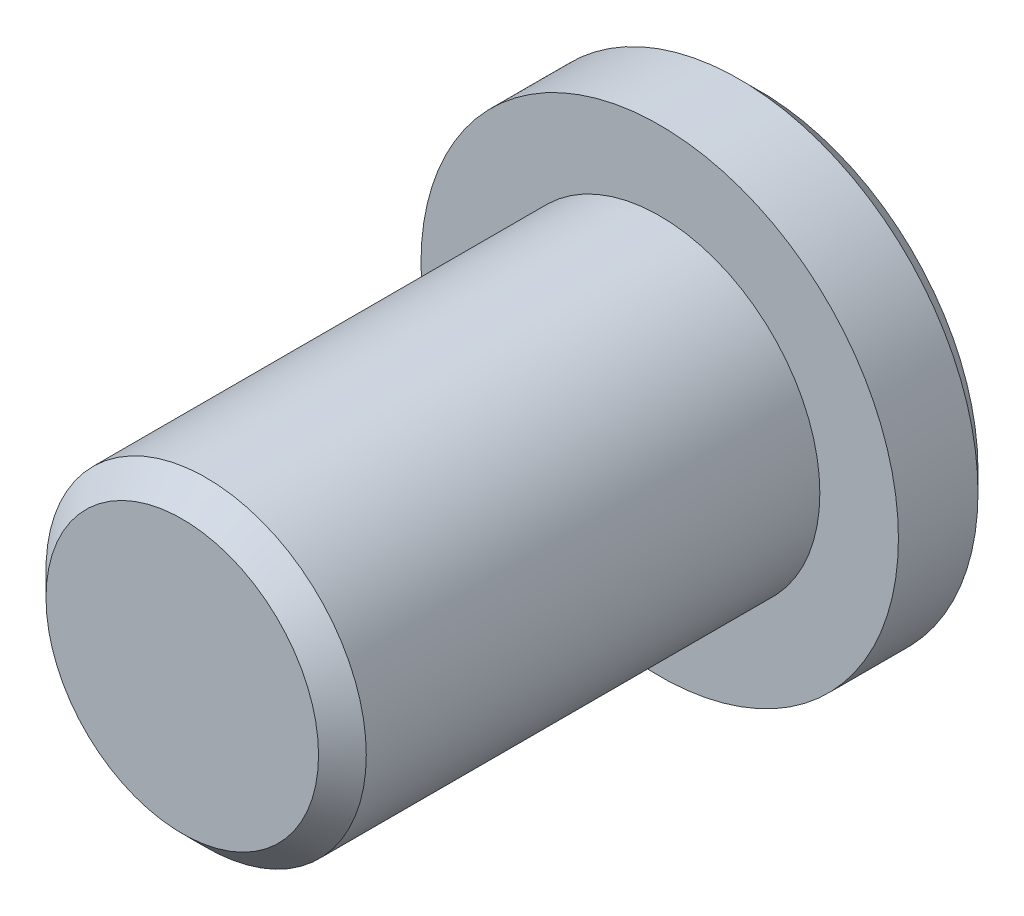
ISO-10303-21;
HEADER;
FILE_DESCRIPTION(('STEP AP214'),'2;1');
FILE_NAME('part.step','',(''),(''),'','','');
FILE_SCHEMA(('AUTOMOTIVE_DESIGN { 1 0 10303 214 1 1 1 1 }'));
ENDSEC;
DATA;
#1=APPLICATION_CONTEXT('core data for automotive mechanical design processes');
#2=APPLICATION_PROTOCOL_DEFINITION('international standard','automotive_design',2000,#1);
#3=PRODUCT_CONTEXT('',#1,'mechanical');
#4=PRODUCT('Part','Part','',(#3));
#5=PRODUCT_RELATED_PRODUCT_CATEGORY('part','',(#4));
#6=PRODUCT_DEFINITION_FORMATION('','',#4);
#7=PRODUCT_DEFINITION_CONTEXT('part definition',#1,'design');
#8=PRODUCT_DEFINITION('design','',#6,#7);
#9=PRODUCT_DEFINITION_SHAPE('','',#8);
#10=(LENGTH_UNIT() NAMED_UNIT(*) SI_UNIT(.MILLI.,.METRE.));
#11=(NAMED_UNIT(*) PLANE_ANGLE_UNIT() SI_UNIT($,.RADIAN.));
#12=(NAMED_UNIT(*) SI_UNIT($,.STERADIAN.) SOLID_ANGLE_UNIT());
#13=UNCERTAINTY_MEASURE_WITH_UNIT(LENGTH_MEASURE(1.E-05),#10,'distance_accuracy_value','');
#14=(GEOMETRIC_REPRESENTATION_CONTEXT(3) GLOBAL_UNCERTAINTY_ASSIGNED_CONTEXT((#13)) GLOBAL_UNIT_ASSIGNED_CONTEXT((#10,
#11,#12)) REPRESENTATION_CONTEXT('',''));
#15=CARTESIAN_POINT('',(0.,0.,0.));
#16=DIRECTION('',(0.,0.,1.));
#17=DIRECTION('',(1.,0.,0.));
#18=AXIS2_PLACEMENT_3D('',#15,#16,#17);
#19=CARTESIAN_POINT('',(0.,0.,14.5));
#20=DIRECTION('',(0.,0.,1.));
#21=DIRECTION('',(1.,0.,0.));
#22=AXIS2_PLACEMENT_3D('',#19,#20,#21);
#23=PLANE('',#22);
#24=CARTESIAN_POINT('',(0.,0.,14.5));
#25=DIRECTION('',(0.,0.,1.));
#26=DIRECTION('',(1.,0.,0.));
#27=AXIS2_PLACEMENT_3D('',#24,#25,#26);
#28=CIRCLE('',#27,3.425);
#29=CARTESIAN_POINT('',(3.425,0.,14.5));
#30=VERTEX_POINT('',#29);
#31=EDGE_CURVE('E10',#30,#30,#28,.T.);
#32=ORIENTED_EDGE('',*,*,#31,.T.);
#33=EDGE_LOOP('',(#32));
#34=FACE_BOUND('',#33,.T.);
#35=ADVANCED_FACE('F15',(#34),#23,.T.);
#36=CARTESIAN_POINT('',(0.,0.,13.9));
#37=DIRECTION('',(0.,0.,-1.));
#38=DIRECTION('',(1.,0.,0.));
#39=AXIS2_PLACEMENT_3D('',#36,#37,#38);
#40=CONICAL_SURFACE('',#39,4.025,0.785398163397);
#41=ORIENTED_EDGE('',*,*,#31,.F.);
#42=EDGE_LOOP('',(#41));
#43=FACE_BOUND('',#42,.T.);
#44=CARTESIAN_POINT('',(0.,0.,13.9));
#45=DIRECTION('',(0.,0.,1.));
#46=DIRECTION('',(1.,0.,0.));
#47=AXIS2_PLACEMENT_3D('',#44,#45,#46);
#48=CIRCLE('',#47,4.025);
#49=CARTESIAN_POINT('',(4.025,0.,13.9));
#50=VERTEX_POINT('',#49);
#51=EDGE_CURVE('E18',#50,#50,#48,.T.);
#52=ORIENTED_EDGE('',*,*,#51,.T.);
#53=EDGE_LOOP('',(#52));
#54=FACE_BOUND('',#53,.T.);
#55=ADVANCED_FACE('F107',(#43,#54),#40,.T.);
#56=CARTESIAN_POINT('',(0.,0.,2.5));
#57=DIRECTION('',(0.,0.,1.));
#58=DIRECTION('',(1.,0.,0.));
#59=AXIS2_PLACEMENT_3D('',#56,#57,#58);
#60=CYLINDRICAL_SURFACE('',#59,4.025);
#61=ORIENTED_EDGE('',*,*,#51,.F.);
#62=EDGE_LOOP('',(#61));
#63=FACE_BOUND('',#62,.T.);
#64=CARTESIAN_POINT('',(0.,0.,2.5));
#65=DIRECTION('',(0.,0.,1.));
#66=DIRECTION('',(1.,0.,0.));
#67=AXIS2_PLACEMENT_3D('',#64,#65,#66);
#68=CIRCLE('',#67,4.025);
#69=CARTESIAN_POINT('',(4.025,0.,2.5));
#70=VERTEX_POINT('',#69);
#71=EDGE_CURVE('E32',#70,#70,#68,.T.);
#72=ORIENTED_EDGE('',*,*,#71,.T.);
#73=EDGE_LOOP('',(#72));
#74=FACE_BOUND('',#73,.T.);
#75=ADVANCED_FACE('F49',(#63,#74),#60,.T.);
#76=CARTESIAN_POINT('',(0.,0.,0.));
#77=DIRECTION('',(0.,0.,1.));
#78=DIRECTION('',(1.,0.,0.));
#79=AXIS2_PLACEMENT_3D('',#76,#77,#78);
#80=PLANE('',#79);
#81=CARTESIAN_POINT('',(0.,0.,0.));
#82=DIRECTION('',(0.,0.,1.));
#83=DIRECTION('',(1.,0.,0.));
#84=AXIS2_PLACEMENT_3D('',#81,#82,#83);
#85=CIRCLE('',#84,5.5);
#86=CARTESIAN_POINT('',(5.5,0.,0.));
#87=VERTEX_POINT('',#86);
#88=EDGE_CURVE('E40',#87,#87,#85,.T.);
#89=ORIENTED_EDGE('',*,*,#88,.F.);
#90=EDGE_LOOP('',(#89));
#91=FACE_BOUND('',#90,.T.);
#92=ADVANCED_FACE('F55',(#91),#80,.F.);
#93=CARTESIAN_POINT('',(0.,0.,2.5));
#94=DIRECTION('',(0.,0.,1.));
#95=DIRECTION('',(1.,0.,0.));
#96=AXIS2_PLACEMENT_3D('',#93,#94,#95);
#97=PLANE('',#96);
#98=ORIENTED_EDGE('',*,*,#71,.F.);
#99=EDGE_LOOP('',(#98));
#100=FACE_BOUND('',#99,.T.);
#101=CARTESIAN_POINT('',(0.,0.,2.5));
#102=DIRECTION('',(0.,0.,1.));
#103=DIRECTION('',(1.,0.,0.));
#104=AXIS2_PLACEMENT_3D('',#101,#102,#103);
#105=CIRCLE('',#104,6.);
#106=CARTESIAN_POINT('',(6.,0.,2.5));
#107=VERTEX_POINT('',#106);
#108=EDGE_CURVE('E35',#107,#107,#105,.T.);
#109=ORIENTED_EDGE('',*,*,#108,.T.);
#110=EDGE_LOOP('',(#109));
#111=FACE_BOUND('',#110,.T.);
#112=ADVANCED_FACE('F51',(#100,#111),#97,.T.);
#113=CARTESIAN_POINT('',(0.,0.,0.5));
#114=DIRECTION('',(0.,0.,1.));
#115=DIRECTION('',(1.,0.,0.));
#116=AXIS2_PLACEMENT_3D('',#113,#114,#115);
#117=CONICAL_SURFACE('',#116,6.,0.785398163397);
#118=ORIENTED_EDGE('',*,*,#88,.T.);
#119=EDGE_LOOP('',(#118));
#120=FACE_BOUND('',#119,.T.);
#121=CARTESIAN_POINT('',(0.,0.,0.5));
#122=DIRECTION('',(0.,0.,1.));
#123=DIRECTION('',(1.,0.,0.));
#124=AXIS2_PLACEMENT_3D('',#121,#122,#123);
#125=CIRCLE('',#124,6.);
#126=CARTESIAN_POINT('',(6.,0.,0.5));
#127=VERTEX_POINT('',#126);
#128=EDGE_CURVE('E36',#127,#127,#125,.T.);
#129=ORIENTED_EDGE('',*,*,#128,.F.);
#130=EDGE_LOOP('',(#129));
#131=FACE_BOUND('',#130,.T.);
#132=ADVANCED_FACE('F54',(#120,#131),#117,.T.);
#133=CARTESIAN_POINT('',(0.,0.,0.));
#134=DIRECTION('',(0.,0.,1.));
#135=DIRECTION('',(1.,0.,0.));
#136=AXIS2_PLACEMENT_3D('',#133,#134,#135);
#137=CYLINDRICAL_SURFACE('',#136,6.);
#138=ORIENTED_EDGE('',*,*,#108,.F.);
#139=EDGE_LOOP('',(#138));
#140=FACE_BOUND('',#139,.T.);
#141=ORIENTED_EDGE('',*,*,#128,.T.);
#142=EDGE_LOOP('',(#141));
#143=FACE_BOUND('',#142,.T.);
#144=ADVANCED_FACE('F79',(#140,#143),#137,.T.);
#145=CLOSED_SHELL('',(#35,#55,#75,#92,#112,#132,#144));
#146=MANIFOLD_SOLID_BREP('B1',#145);
#147=ADVANCED_BREP_SHAPE_REPRESENTATION('',(#18,#146),#14);
#148=SHAPE_DEFINITION_REPRESENTATION(#9,#147);
ENDSEC;
END-ISO-10303-21;
